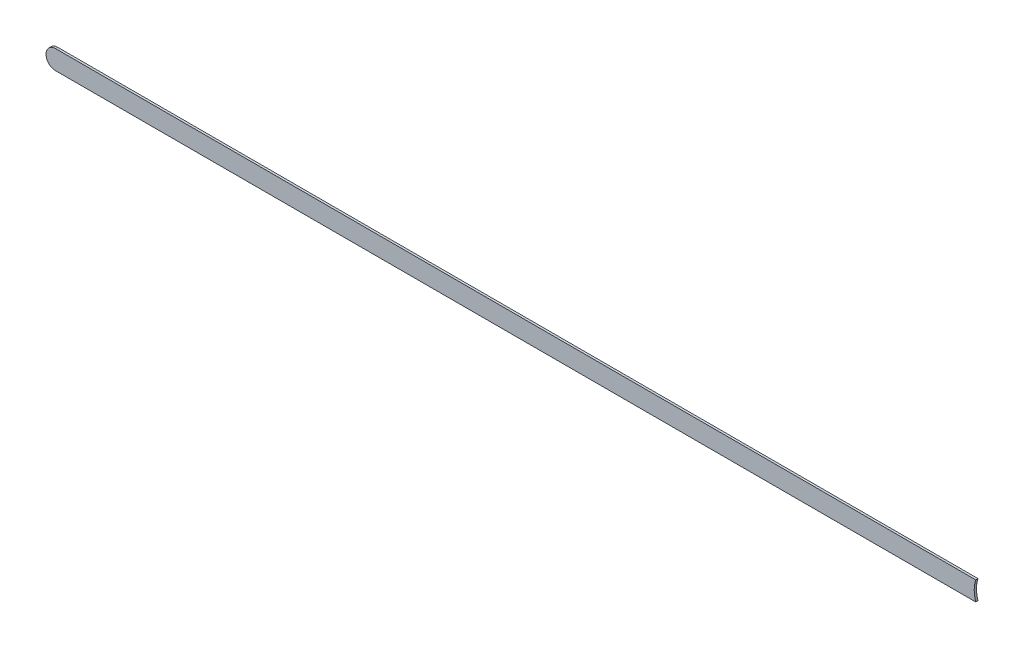
ISO-10303-21;
HEADER;
FILE_DESCRIPTION(('STEP AP214'),'2;1');
FILE_NAME('part.step','',(''),(''),'','','');
FILE_SCHEMA(('AUTOMOTIVE_DESIGN { 1 0 10303 214 1 1 1 1 }'));
ENDSEC;
DATA;
#1=APPLICATION_CONTEXT('core data for automotive mechanical design processes');
#2=APPLICATION_PROTOCOL_DEFINITION('international standard','automotive_design',2000,#1);
#3=PRODUCT_CONTEXT('',#1,'mechanical');
#4=PRODUCT('Part','Part','',(#3));
#5=PRODUCT_RELATED_PRODUCT_CATEGORY('part','',(#4));
#6=PRODUCT_DEFINITION_FORMATION('','',#4);
#7=PRODUCT_DEFINITION_CONTEXT('part definition',#1,'design');
#8=PRODUCT_DEFINITION('design','',#6,#7);
#9=PRODUCT_DEFINITION_SHAPE('','',#8);
#10=(LENGTH_UNIT() NAMED_UNIT(*) SI_UNIT(.MILLI.,.METRE.));
#11=(NAMED_UNIT(*) PLANE_ANGLE_UNIT() SI_UNIT($,.RADIAN.));
#12=(NAMED_UNIT(*) SI_UNIT($,.STERADIAN.) SOLID_ANGLE_UNIT());
#13=UNCERTAINTY_MEASURE_WITH_UNIT(LENGTH_MEASURE(1.E-05),#10,'distance_accuracy_value','');
#14=(GEOMETRIC_REPRESENTATION_CONTEXT(3) GLOBAL_UNCERTAINTY_ASSIGNED_CONTEXT((#13)) GLOBAL_UNIT_ASSIGNED_CONTEXT((#10,
#11,#12)) REPRESENTATION_CONTEXT('',''));
#15=CARTESIAN_POINT('',(0.,0.,0.));
#16=DIRECTION('',(0.,0.,1.));
#17=DIRECTION('',(1.,0.,0.));
#18=AXIS2_PLACEMENT_3D('',#15,#16,#17);
#19=CARTESIAN_POINT('',(151.345,-65.729999,1.6));
#20=DIRECTION('',(0.,-1.,0.));
#21=DIRECTION('',(0.,0.,-1.));
#22=AXIS2_PLACEMENT_3D('',#19,#20,#21);
#23=PLANE('',#22);
#24=DIRECTION('',(0.,0.,1.));
#25=VECTOR('',#24,1.);
#26=CARTESIAN_POINT('',(136.490001,-65.729999,1.6));
#27=LINE('',#26,#25);
#28=CARTESIAN_POINT('',(136.490001,-65.729999,1.6));
#29=VERTEX_POINT('',#28);
#30=CARTESIAN_POINT('',(136.490001,-65.729999,1.635));
#31=VERTEX_POINT('',#30);
#32=EDGE_CURVE('E11',#29,#31,#27,.T.);
#33=ORIENTED_EDGE('',*,*,#32,.T.);
#34=DIRECTION('',(-1.,0.,0.));
#35=VECTOR('',#34,1.);
#36=CARTESIAN_POINT('',(151.345,-65.729999,1.635));
#37=LINE('',#36,#35);
#38=CARTESIAN_POINT('',(150.89430609057,-65.729999,1.635));
#39=VERTEX_POINT('',#38);
#40=EDGE_CURVE('E20',#39,#31,#37,.T.);
#41=ORIENTED_EDGE('',*,*,#40,.F.);
#42=DIRECTION('',(0.,0.,-1.));
#43=VECTOR('',#42,1.);
#44=CARTESIAN_POINT('',(150.89430609056,-65.729999,-0.045));
#45=LINE('',#44,#43);
#46=CARTESIAN_POINT('',(150.89430609057,-65.729999,1.6));
#47=VERTEX_POINT('',#46);
#48=EDGE_CURVE('E74',#39,#47,#45,.T.);
#49=ORIENTED_EDGE('',*,*,#48,.T.);
#50=DIRECTION('',(-1.,0.,0.));
#51=VECTOR('',#50,1.);
#52=CARTESIAN_POINT('',(151.345,-65.729999,1.6));
#53=LINE('',#52,#51);
#54=EDGE_CURVE('E107',#47,#29,#53,.T.);
#55=ORIENTED_EDGE('',*,*,#54,.T.);
#56=EDGE_LOOP('',(#33,#41,#49,#55));
#57=FACE_BOUND('',#56,.T.);
#58=ADVANCED_FACE('F17',(#57),#23,.F.);
#59=CARTESIAN_POINT('',(136.490001,-65.879999,1.6));
#60=DIRECTION('',(0.,0.,-1.));
#61=DIRECTION('',(0.,1.,0.));
#62=AXIS2_PLACEMENT_3D('',#59,#60,#61);
#63=CYLINDRICAL_SURFACE('',#62,0.15);
#64=CARTESIAN_POINT('',(136.490001,-65.879999,1.6));
#65=DIRECTION('',(0.,0.,1.));
#66=DIRECTION('',(0.,1.,0.));
#67=AXIS2_PLACEMENT_3D('',#64,#65,#66);
#68=CIRCLE('',#67,0.15);
#69=CARTESIAN_POINT('',(136.490001,-66.029999,1.6));
#70=VERTEX_POINT('',#69);
#71=EDGE_CURVE('E77',#29,#70,#68,.T.);
#72=ORIENTED_EDGE('',*,*,#71,.T.);
#73=DIRECTION('',(0.,0.,1.));
#74=VECTOR('',#73,1.);
#75=CARTESIAN_POINT('',(136.490001,-66.029999,1.6));
#76=LINE('',#75,#74);
#77=CARTESIAN_POINT('',(136.490001,-66.029999,1.635));
#78=VERTEX_POINT('',#77);
#79=EDGE_CURVE('E87',#70,#78,#76,.T.);
#80=ORIENTED_EDGE('',*,*,#79,.T.);
#81=CARTESIAN_POINT('',(136.490001,-65.879999,1.635));
#82=DIRECTION('',(0.,0.,1.));
#83=DIRECTION('',(0.,1.,0.));
#84=AXIS2_PLACEMENT_3D('',#81,#82,#83);
#85=CIRCLE('',#84,0.15);
#86=EDGE_CURVE('E82',#31,#78,#85,.T.);
#87=ORIENTED_EDGE('',*,*,#86,.F.);
#88=ORIENTED_EDGE('',*,*,#32,.F.);
#89=EDGE_LOOP('',(#72,#80,#87,#88));
#90=FACE_BOUND('',#89,.T.);
#91=ADVANCED_FACE('F121',(#90),#63,.T.);
#92=CARTESIAN_POINT('',(136.490001,-66.029999,1.635));
#93=DIRECTION('',(0.,0.,1.));
#94=DIRECTION('',(1.,0.,0.));
#95=AXIS2_PLACEMENT_3D('',#92,#93,#94);
#96=PLANE('',#95);
#97=ORIENTED_EDGE('',*,*,#86,.T.);
#98=DIRECTION('',(1.,0.,0.));
#99=VECTOR('',#98,1.);
#100=CARTESIAN_POINT('',(136.490001,-66.029999,1.635));
#101=LINE('',#100,#99);
#102=CARTESIAN_POINT('',(150.89430609056,-66.029999,1.635));
#103=VERTEX_POINT('',#102);
#104=EDGE_CURVE('E79',#78,#103,#101,.T.);
#105=ORIENTED_EDGE('',*,*,#104,.T.);
#106=CARTESIAN_POINT('',(151.345,-65.879999,1.635));
#107=DIRECTION('',(0.,0.,-1.));
#108=DIRECTION('',(0.,-1.,0.));
#109=AXIS2_PLACEMENT_3D('',#106,#107,#108);
#110=CIRCLE('',#109,0.475);
#111=EDGE_CURVE('E68',#103,#39,#110,.T.);
#112=ORIENTED_EDGE('',*,*,#111,.T.);
#113=ORIENTED_EDGE('',*,*,#40,.T.);
#114=EDGE_LOOP('',(#97,#105,#112,#113));
#115=FACE_BOUND('',#114,.T.);
#116=ADVANCED_FACE('F80',(#115),#96,.T.);
#117=CARTESIAN_POINT('',(151.345,-65.879999,-0.045));
#118=DIRECTION('',(0.,0.,-1.));
#119=DIRECTION('',(0.,-1.,0.));
#120=AXIS2_PLACEMENT_3D('',#117,#118,#119);
#121=CYLINDRICAL_SURFACE('',#120,0.475);
#122=ORIENTED_EDGE('',*,*,#111,.F.);
#123=DIRECTION('',(0.,0.,-1.));
#124=VECTOR('',#123,1.);
#125=CARTESIAN_POINT('',(150.89430609056,-66.029999,-0.045));
#126=LINE('',#125,#124);
#127=CARTESIAN_POINT('',(150.89430609056,-66.029999,1.6));
#128=VERTEX_POINT('',#127);
#129=EDGE_CURVE('E73',#103,#128,#126,.T.);
#130=ORIENTED_EDGE('',*,*,#129,.T.);
#131=CARTESIAN_POINT('',(151.345,-65.879999,1.6));
#132=DIRECTION('',(0.,0.,-1.));
#133=DIRECTION('',(0.,-1.,0.));
#134=AXIS2_PLACEMENT_3D('',#131,#132,#133);
#135=CIRCLE('',#134,0.475);
#136=EDGE_CURVE('E110',#128,#47,#135,.T.);
#137=ORIENTED_EDGE('',*,*,#136,.T.);
#138=ORIENTED_EDGE('',*,*,#48,.F.);
#139=EDGE_LOOP('',(#122,#130,#137,#138));
#140=FACE_BOUND('',#139,.T.);
#141=ADVANCED_FACE('F70',(#140),#121,.F.);
#142=CARTESIAN_POINT('',(136.490001,-66.029999,1.6));
#143=DIRECTION('',(0.,0.,1.));
#144=DIRECTION('',(1.,0.,0.));
#145=AXIS2_PLACEMENT_3D('',#142,#143,#144);
#146=PLANE('',#145);
#147=ORIENTED_EDGE('',*,*,#54,.F.);
#148=ORIENTED_EDGE('',*,*,#136,.F.);
#149=DIRECTION('',(1.,0.,0.));
#150=VECTOR('',#149,1.);
#151=CARTESIAN_POINT('',(136.490001,-66.029999,1.6));
#152=LINE('',#151,#150);
#153=EDGE_CURVE('E92',#70,#128,#152,.T.);
#154=ORIENTED_EDGE('',*,*,#153,.F.);
#155=ORIENTED_EDGE('',*,*,#71,.F.);
#156=EDGE_LOOP('',(#147,#148,#154,#155));
#157=FACE_BOUND('',#156,.T.);
#158=ADVANCED_FACE('F119',(#157),#146,.F.);
#159=CARTESIAN_POINT('',(136.490001,-66.029999,1.6));
#160=DIRECTION('',(0.,1.,0.));
#161=DIRECTION('',(1.,0.,0.));
#162=AXIS2_PLACEMENT_3D('',#159,#160,#161);
#163=PLANE('',#162);
#164=ORIENTED_EDGE('',*,*,#129,.F.);
#165=ORIENTED_EDGE('',*,*,#104,.F.);
#166=ORIENTED_EDGE('',*,*,#79,.F.);
#167=ORIENTED_EDGE('',*,*,#153,.T.);
#168=EDGE_LOOP('',(#164,#165,#166,#167));
#169=FACE_BOUND('',#168,.T.);
#170=ADVANCED_FACE('F90',(#169),#163,.F.);
#171=CLOSED_SHELL('',(#58,#91,#116,#141,#158,#170));
#172=MANIFOLD_SOLID_BREP('B1',#171);
#173=ADVANCED_BREP_SHAPE_REPRESENTATION('',(#18,#172),#14);
#174=SHAPE_DEFINITION_REPRESENTATION(#9,#173);
ENDSEC;
END-ISO-10303-21;
